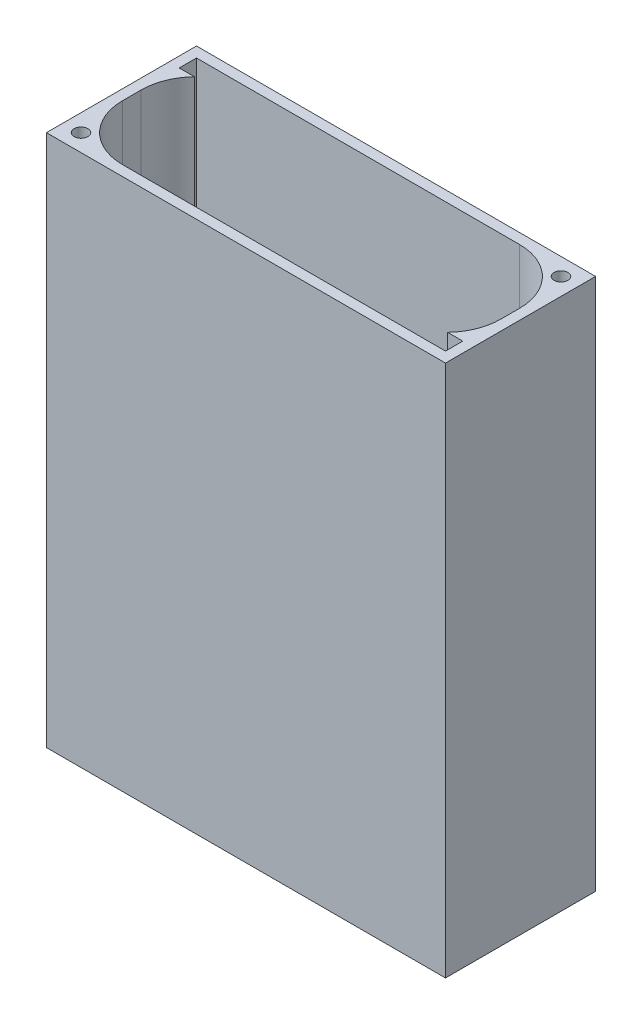
ISO-10303-21;
HEADER;
FILE_DESCRIPTION(('STEP AP214'),'2;1');
FILE_NAME('part.step','',(''),(''),'','','');
FILE_SCHEMA(('AUTOMOTIVE_DESIGN { 1 0 10303 214 1 1 1 1 }'));
ENDSEC;
DATA;
#1=APPLICATION_CONTEXT('core data for automotive mechanical design processes');
#2=APPLICATION_PROTOCOL_DEFINITION('international standard','automotive_design',2000,#1);
#3=PRODUCT_CONTEXT('',#1,'mechanical');
#4=PRODUCT('Part','Part','',(#3));
#5=PRODUCT_RELATED_PRODUCT_CATEGORY('part','',(#4));
#6=PRODUCT_DEFINITION_FORMATION('','',#4);
#7=PRODUCT_DEFINITION_CONTEXT('part definition',#1,'design');
#8=PRODUCT_DEFINITION('design','',#6,#7);
#9=PRODUCT_DEFINITION_SHAPE('','',#8);
#10=(LENGTH_UNIT() NAMED_UNIT(*) SI_UNIT(.MILLI.,.METRE.));
#11=(NAMED_UNIT(*) PLANE_ANGLE_UNIT() SI_UNIT($,.RADIAN.));
#12=(NAMED_UNIT(*) SI_UNIT($,.STERADIAN.) SOLID_ANGLE_UNIT());
#13=UNCERTAINTY_MEASURE_WITH_UNIT(LENGTH_MEASURE(1.E-05),#10,'distance_accuracy_value','');
#14=(GEOMETRIC_REPRESENTATION_CONTEXT(3) GLOBAL_UNCERTAINTY_ASSIGNED_CONTEXT((#13)) GLOBAL_UNIT_ASSIGNED_CONTEXT((#10,
#11,#12)) REPRESENTATION_CONTEXT('',''));
#15=CARTESIAN_POINT('',(0.,0.,0.));
#16=DIRECTION('',(0.,0.,1.));
#17=DIRECTION('',(1.,0.,0.));
#18=AXIS2_PLACEMENT_3D('',#15,#16,#17);
#19=CARTESIAN_POINT('',(0.,2.,0.));
#20=DIRECTION('',(1.,0.,0.));
#21=DIRECTION('',(0.,0.,-1.));
#22=AXIS2_PLACEMENT_3D('',#19,#20,#21);
#23=PLANE('',#22);
#24=DIRECTION('',(0.,0.,1.));
#25=VECTOR('',#24,1.);
#26=CARTESIAN_POINT('',(0.,0.,0.));
#27=LINE('',#26,#25);
#28=CARTESIAN_POINT('',(0.,0.,-21.7));
#29=VERTEX_POINT('',#28);
#30=CARTESIAN_POINT('',(0.,0.,0.));
#31=VERTEX_POINT('',#30);
#32=EDGE_CURVE('E221',#29,#31,#27,.T.);
#33=ORIENTED_EDGE('',*,*,#32,.T.);
#34=DIRECTION('',(0.,-1.,0.));
#35=VECTOR('',#34,1.);
#36=CARTESIAN_POINT('',(0.,2.,0.));
#37=LINE('',#36,#35);
#38=CARTESIAN_POINT('',(0.,77.,0.));
#39=VERTEX_POINT('',#38);
#40=EDGE_CURVE('E239',#39,#31,#37,.T.);
#41=ORIENTED_EDGE('',*,*,#40,.F.);
#42=DIRECTION('',(0.,0.,1.));
#43=VECTOR('',#42,1.);
#44=CARTESIAN_POINT('',(0.,77.,-21.7));
#45=LINE('',#44,#43);
#46=CARTESIAN_POINT('',(0.,77.,-21.7));
#47=VERTEX_POINT('',#46);
#48=EDGE_CURVE('E205',#47,#39,#45,.T.);
#49=ORIENTED_EDGE('',*,*,#48,.F.);
#50=DIRECTION('',(0.,-1.,0.));
#51=VECTOR('',#50,1.);
#52=CARTESIAN_POINT('',(0.,2.,-21.7));
#53=LINE('',#52,#51);
#54=EDGE_CURVE('E230',#47,#29,#53,.T.);
#55=ORIENTED_EDGE('',*,*,#54,.T.);
#56=EDGE_LOOP('',(#33,#41,#49,#55));
#57=FACE_BOUND('',#56,.T.);
#58=ADVANCED_FACE('F33',(#57),#23,.F.);
#59=CARTESIAN_POINT('',(0.,2.,0.));
#60=DIRECTION('',(0.,0.,-1.));
#61=DIRECTION('',(-1.,0.,0.));
#62=AXIS2_PLACEMENT_3D('',#59,#60,#61);
#63=PLANE('',#62);
#64=DIRECTION('',(1.,0.,0.));
#65=VECTOR('',#64,1.);
#66=CARTESIAN_POINT('',(0.,0.,0.));
#67=LINE('',#66,#65);
#68=CARTESIAN_POINT('',(57.7,0.,0.));
#69=VERTEX_POINT('',#68);
#70=EDGE_CURVE('E224',#31,#69,#67,.T.);
#71=ORIENTED_EDGE('',*,*,#70,.T.);
#72=DIRECTION('',(0.,-1.,0.));
#73=VECTOR('',#72,1.);
#74=CARTESIAN_POINT('',(57.7,2.,0.));
#75=LINE('',#74,#73);
#76=CARTESIAN_POINT('',(57.7,77.,0.));
#77=VERTEX_POINT('',#76);
#78=EDGE_CURVE('E236',#77,#69,#75,.T.);
#79=ORIENTED_EDGE('',*,*,#78,.F.);
#80=DIRECTION('',(1.,0.,0.));
#81=VECTOR('',#80,1.);
#82=CARTESIAN_POINT('',(0.,77.,0.));
#83=LINE('',#82,#81);
#84=EDGE_CURVE('E212',#39,#77,#83,.T.);
#85=ORIENTED_EDGE('',*,*,#84,.F.);
#86=ORIENTED_EDGE('',*,*,#40,.T.);
#87=EDGE_LOOP('',(#71,#79,#85,#86));
#88=FACE_BOUND('',#87,.T.);
#89=ADVANCED_FACE('F324',(#88),#63,.F.);
#90=CARTESIAN_POINT('',(57.7,2.,0.));
#91=DIRECTION('',(-1.,0.,0.));
#92=DIRECTION('',(0.,0.,1.));
#93=AXIS2_PLACEMENT_3D('',#90,#91,#92);
#94=PLANE('',#93);
#95=DIRECTION('',(0.,0.,-1.));
#96=VECTOR('',#95,1.);
#97=CARTESIAN_POINT('',(57.7,0.,0.));
#98=LINE('',#97,#96);
#99=CARTESIAN_POINT('',(57.7,0.,-21.7));
#100=VERTEX_POINT('',#99);
#101=EDGE_CURVE('E226',#69,#100,#98,.T.);
#102=ORIENTED_EDGE('',*,*,#101,.T.);
#103=DIRECTION('',(0.,-1.,0.));
#104=VECTOR('',#103,1.);
#105=CARTESIAN_POINT('',(57.7,2.,-21.7));
#106=LINE('',#105,#104);
#107=CARTESIAN_POINT('',(57.7,77.,-21.7));
#108=VERTEX_POINT('',#107);
#109=EDGE_CURVE('E233',#108,#100,#106,.T.);
#110=ORIENTED_EDGE('',*,*,#109,.F.);
#111=DIRECTION('',(0.,0.,-1.));
#112=VECTOR('',#111,1.);
#113=CARTESIAN_POINT('',(57.7,77.,-21.7));
#114=LINE('',#113,#112);
#115=EDGE_CURVE('E215',#77,#108,#114,.T.);
#116=ORIENTED_EDGE('',*,*,#115,.F.);
#117=ORIENTED_EDGE('',*,*,#78,.T.);
#118=EDGE_LOOP('',(#102,#110,#116,#117));
#119=FACE_BOUND('',#118,.T.);
#120=ADVANCED_FACE('F330',(#119),#94,.F.);
#121=CARTESIAN_POINT('',(0.,2.,-21.7));
#122=DIRECTION('',(0.,0.,1.));
#123=DIRECTION('',(1.,0.,0.));
#124=AXIS2_PLACEMENT_3D('',#121,#122,#123);
#125=PLANE('',#124);
#126=DIRECTION('',(-1.,0.,0.));
#127=VECTOR('',#126,1.);
#128=CARTESIAN_POINT('',(0.,0.,-21.7));
#129=LINE('',#128,#127);
#130=EDGE_CURVE('E228',#100,#29,#129,.T.);
#131=ORIENTED_EDGE('',*,*,#130,.T.);
#132=ORIENTED_EDGE('',*,*,#54,.F.);
#133=DIRECTION('',(-1.,0.,0.));
#134=VECTOR('',#133,1.);
#135=CARTESIAN_POINT('',(0.,77.,-21.7));
#136=LINE('',#135,#134);
#137=EDGE_CURVE('E218',#108,#47,#136,.T.);
#138=ORIENTED_EDGE('',*,*,#137,.F.);
#139=ORIENTED_EDGE('',*,*,#109,.T.);
#140=EDGE_LOOP('',(#131,#132,#138,#139));
#141=FACE_BOUND('',#140,.T.);
#142=ADVANCED_FACE('F461',(#141),#125,.F.);
#143=CARTESIAN_POINT('',(0.,0.,0.));
#144=DIRECTION('',(0.,-1.,0.));
#145=DIRECTION('',(0.,0.,-1.));
#146=AXIS2_PLACEMENT_3D('',#143,#144,#145);
#147=PLANE('',#146);
#148=CARTESIAN_POINT('',(46.85,0.,-10.85));
#149=DIRECTION('',(0.,-1.,0.));
#150=DIRECTION('',(0.,0.,-1.));
#151=AXIS2_PLACEMENT_3D('',#148,#149,#150);
#152=CIRCLE('',#151,1.5);
#153=CARTESIAN_POINT('',(46.85,0.,-12.35));
#154=VERTEX_POINT('',#153);
#155=EDGE_CURVE('E501',#154,#154,#152,.T.);
#156=ORIENTED_EDGE('',*,*,#155,.F.);
#157=EDGE_LOOP('',(#156));
#158=FACE_BOUND('',#157,.T.);
#159=CARTESIAN_POINT('',(10.85,0.,-10.85));
#160=DIRECTION('',(0.,-1.,0.));
#161=DIRECTION('',(0.,0.,-1.));
#162=AXIS2_PLACEMENT_3D('',#159,#160,#161);
#163=CIRCLE('',#162,1.5);
#164=CARTESIAN_POINT('',(10.85,0.,-12.35));
#165=VERTEX_POINT('',#164);
#166=EDGE_CURVE('E505',#165,#165,#163,.T.);
#167=ORIENTED_EDGE('',*,*,#166,.F.);
#168=EDGE_LOOP('',(#167));
#169=FACE_BOUND('',#168,.T.);
#170=CARTESIAN_POINT('',(28.85,0.,-10.85));
#171=DIRECTION('',(0.,-1.,0.));
#172=DIRECTION('',(0.,0.,-1.));
#173=AXIS2_PLACEMENT_3D('',#170,#171,#172);
#174=CIRCLE('',#173,1.5);
#175=CARTESIAN_POINT('',(28.85,0.,-12.35));
#176=VERTEX_POINT('',#175);
#177=EDGE_CURVE('E517',#176,#176,#174,.T.);
#178=ORIENTED_EDGE('',*,*,#177,.F.);
#179=EDGE_LOOP('',(#178));
#180=FACE_BOUND('',#179,.T.);
#181=ORIENTED_EDGE('',*,*,#32,.F.);
#182=ORIENTED_EDGE('',*,*,#130,.F.);
#183=ORIENTED_EDGE('',*,*,#101,.F.);
#184=ORIENTED_EDGE('',*,*,#70,.F.);
#185=EDGE_LOOP('',(#181,#182,#183,#184));
#186=FACE_BOUND('',#185,.T.);
#187=ADVANCED_FACE('F410',(#158,#169,#180,#186),#147,.T.);
#188=CARTESIAN_POINT('',(0.,77.,0.));
#189=DIRECTION('',(0.,1.,0.));
#190=DIRECTION('',(0.,0.,1.));
#191=AXIS2_PLACEMENT_3D('',#188,#189,#190);
#192=PLANE('',#191);
#193=CARTESIAN_POINT('',(2.5,77.,-2.5));
#194=DIRECTION('',(0.,1.,0.));
#195=DIRECTION('',(0.,0.,1.));
#196=AXIS2_PLACEMENT_3D('',#193,#194,#195);
#197=CIRCLE('',#196,1.);
#198=CARTESIAN_POINT('',(2.5,77.,-1.5));
#199=VERTEX_POINT('',#198);
#200=EDGE_CURVE('E520',#199,#199,#197,.T.);
#201=ORIENTED_EDGE('',*,*,#200,.F.);
#202=EDGE_LOOP('',(#201));
#203=FACE_BOUND('',#202,.T.);
#204=CARTESIAN_POINT('',(55.2,77.,-19.2));
#205=DIRECTION('',(0.,1.,0.));
#206=DIRECTION('',(0.,0.,1.));
#207=AXIS2_PLACEMENT_3D('',#204,#205,#206);
#208=CIRCLE('',#207,0.999999999999998);
#209=CARTESIAN_POINT('',(55.2,77.,-18.2));
#210=VERTEX_POINT('',#209);
#211=EDGE_CURVE('E174',#210,#210,#208,.T.);
#212=ORIENTED_EDGE('',*,*,#211,.F.);
#213=EDGE_LOOP('',(#212));
#214=FACE_BOUND('',#213,.T.);
#215=DIRECTION('',(-1.,0.,0.));
#216=VECTOR('',#215,1.);
#217=CARTESIAN_POINT('',(39.110599511968,77.,-4.));
#218=LINE('',#217,#216);
#219=CARTESIAN_POINT('',(56.2,77.,-4.));
#220=VERTEX_POINT('',#219);
#221=CARTESIAN_POINT('',(54.0094750193111,77.,-4.));
#222=VERTEX_POINT('',#221);
#223=EDGE_CURVE('E168',#220,#222,#218,.T.);
#224=ORIENTED_EDGE('',*,*,#223,.F.);
#225=DIRECTION('',(0.,0.,-1.));
#226=VECTOR('',#225,1.);
#227=CARTESIAN_POINT('',(56.2,77.,-1.5));
#228=LINE('',#227,#226);
#229=CARTESIAN_POINT('',(56.2,77.,-1.5));
#230=VERTEX_POINT('',#229);
#231=EDGE_CURVE('E171',#230,#220,#228,.T.);
#232=ORIENTED_EDGE('',*,*,#231,.F.);
#233=DIRECTION('',(1.,0.,0.));
#234=VECTOR('',#233,1.);
#235=CARTESIAN_POINT('',(1.5,77.,-1.5));
#236=LINE('',#235,#234);
#237=CARTESIAN_POINT('',(9.5,77.,-1.5));
#238=VERTEX_POINT('',#237);
#239=EDGE_CURVE('E161',#238,#230,#236,.T.);
#240=ORIENTED_EDGE('',*,*,#239,.F.);
#241=CARTESIAN_POINT('',(9.5,77.,-9.5));
#242=DIRECTION('',(0.,1.,0.));
#243=DIRECTION('',(0.,0.,1.));
#244=AXIS2_PLACEMENT_3D('',#241,#242,#243);
#245=CIRCLE('',#244,8.);
#246=CARTESIAN_POINT('',(1.5,77.,-9.5));
#247=VERTEX_POINT('',#246);
#248=EDGE_CURVE('E268',#238,#247,#245,.F.);
#249=ORIENTED_EDGE('',*,*,#248,.T.);
#250=DIRECTION('',(0.,0.,1.));
#251=VECTOR('',#250,1.);
#252=CARTESIAN_POINT('',(1.5,77.,-20.2));
#253=LINE('',#252,#251);
#254=CARTESIAN_POINT('',(1.5,77.,-12.2));
#255=VERTEX_POINT('',#254);
#256=EDGE_CURVE('E198',#255,#247,#253,.T.);
#257=ORIENTED_EDGE('',*,*,#256,.F.);
#258=CARTESIAN_POINT('',(9.5,77.,-12.2));
#259=DIRECTION('',(0.,1.,0.));
#260=DIRECTION('',(0.,0.,1.));
#261=AXIS2_PLACEMENT_3D('',#258,#259,#260);
#262=CIRCLE('',#261,8.);
#263=CARTESIAN_POINT('',(3.69052498068887,77.,-17.7));
#264=VERTEX_POINT('',#263);
#265=EDGE_CURVE('E270',#255,#264,#262,.F.);
#266=ORIENTED_EDGE('',*,*,#265,.T.);
#267=DIRECTION('',(1.,0.,0.));
#268=VECTOR('',#267,1.);
#269=CARTESIAN_POINT('',(40.0835873967236,77.,-17.7));
#270=LINE('',#269,#268);
#271=CARTESIAN_POINT('',(1.5,77.,-17.7));
#272=VERTEX_POINT('',#271);
#273=EDGE_CURVE('E56',#272,#264,#270,.T.);
#274=ORIENTED_EDGE('',*,*,#273,.F.);
#275=DIRECTION('',(0.,0.,1.));
#276=VECTOR('',#275,1.);
#277=CARTESIAN_POINT('',(1.5,77.,-20.2));
#278=LINE('',#277,#276);
#279=CARTESIAN_POINT('',(1.5,77.,-20.2));
#280=VERTEX_POINT('',#279);
#281=EDGE_CURVE('E179',#280,#272,#278,.T.);
#282=ORIENTED_EDGE('',*,*,#281,.F.);
#283=DIRECTION('',(-1.,0.,0.));
#284=VECTOR('',#283,1.);
#285=CARTESIAN_POINT('',(1.5,77.,-20.2));
#286=LINE('',#285,#284);
#287=CARTESIAN_POINT('',(48.2,77.,-20.2));
#288=VERTEX_POINT('',#287);
#289=EDGE_CURVE('E196',#288,#280,#286,.T.);
#290=ORIENTED_EDGE('',*,*,#289,.F.);
#291=CARTESIAN_POINT('',(48.2,77.,-12.2));
#292=DIRECTION('',(0.,1.,0.));
#293=DIRECTION('',(0.,0.,1.));
#294=AXIS2_PLACEMENT_3D('',#291,#292,#293);
#295=CIRCLE('',#294,8.);
#296=CARTESIAN_POINT('',(56.2,77.,-12.2));
#297=VERTEX_POINT('',#296);
#298=EDGE_CURVE('E266',#288,#297,#295,.F.);
#299=ORIENTED_EDGE('',*,*,#298,.T.);
#300=DIRECTION('',(0.,0.,-1.));
#301=VECTOR('',#300,1.);
#302=CARTESIAN_POINT('',(56.2,77.,-20.2));
#303=LINE('',#302,#301);
#304=CARTESIAN_POINT('',(56.2,77.,-9.5));
#305=VERTEX_POINT('',#304);
#306=EDGE_CURVE('E202',#305,#297,#303,.T.);
#307=ORIENTED_EDGE('',*,*,#306,.F.);
#308=CARTESIAN_POINT('',(48.2,77.,-9.5));
#309=DIRECTION('',(0.,1.,0.));
#310=DIRECTION('',(0.,0.,1.));
#311=AXIS2_PLACEMENT_3D('',#308,#309,#310);
#312=CIRCLE('',#311,8.);
#313=EDGE_CURVE('E263',#305,#222,#312,.F.);
#314=ORIENTED_EDGE('',*,*,#313,.T.);
#315=EDGE_LOOP('',(#224,#232,#240,#249,#257,#266,#274,#282,#290,#299,#307,#314));
#316=FACE_BOUND('',#315,.T.);
#317=ORIENTED_EDGE('',*,*,#48,.T.);
#318=ORIENTED_EDGE('',*,*,#84,.T.);
#319=ORIENTED_EDGE('',*,*,#115,.T.);
#320=ORIENTED_EDGE('',*,*,#137,.T.);
#321=EDGE_LOOP('',(#317,#318,#319,#320));
#322=FACE_BOUND('',#321,.T.);
#323=ADVANCED_FACE('F279',(#203,#214,#316,#322),#192,.T.);
#324=CARTESIAN_POINT('',(1.5,77.,-20.2));
#325=DIRECTION('',(0.,0.,1.));
#326=DIRECTION('',(1.,0.,0.));
#327=AXIS2_PLACEMENT_3D('',#324,#325,#326);
#328=PLANE('',#327);
#329=ORIENTED_EDGE('',*,*,#289,.T.);
#330=DIRECTION('',(0.,1.,0.));
#331=VECTOR('',#330,1.);
#332=CARTESIAN_POINT('',(1.5,-36.6644955534222,-20.2));
#333=LINE('',#332,#331);
#334=CARTESIAN_POINT('',(1.5,2.,-20.2));
#335=VERTEX_POINT('',#334);
#336=EDGE_CURVE('E182',#335,#280,#333,.T.);
#337=ORIENTED_EDGE('',*,*,#336,.F.);
#338=DIRECTION('',(-1.,0.,0.));
#339=VECTOR('',#338,1.);
#340=CARTESIAN_POINT('',(1.5,2.,-20.2));
#341=LINE('',#340,#339);
#342=CARTESIAN_POINT('',(48.2,2.,-20.2));
#343=VERTEX_POINT('',#342);
#344=EDGE_CURVE('E188',#343,#335,#341,.T.);
#345=ORIENTED_EDGE('',*,*,#344,.F.);
#346=DIRECTION('',(0.,-1.,0.));
#347=VECTOR('',#346,1.);
#348=CARTESIAN_POINT('',(48.2,77.,-20.2));
#349=LINE('',#348,#347);
#350=EDGE_CURVE('E256',#343,#288,#349,.F.);
#351=ORIENTED_EDGE('',*,*,#350,.T.);
#352=EDGE_LOOP('',(#329,#337,#345,#351));
#353=FACE_BOUND('',#352,.T.);
#354=ADVANCED_FACE('F309',(#353),#328,.T.);
#355=CARTESIAN_POINT('',(1.5,77.,-20.2));
#356=DIRECTION('',(1.,0.,0.));
#357=DIRECTION('',(0.,0.,-1.));
#358=AXIS2_PLACEMENT_3D('',#355,#356,#357);
#359=PLANE('',#358);
#360=ORIENTED_EDGE('',*,*,#256,.T.);
#361=DIRECTION('',(0.,-1.,0.));
#362=VECTOR('',#361,1.);
#363=CARTESIAN_POINT('',(1.5,2.,-9.5));
#364=LINE('',#363,#362);
#365=CARTESIAN_POINT('',(1.5,2.,-9.5));
#366=VERTEX_POINT('',#365);
#367=EDGE_CURVE('E260',#247,#366,#364,.T.);
#368=ORIENTED_EDGE('',*,*,#367,.T.);
#369=DIRECTION('',(0.,0.,1.));
#370=VECTOR('',#369,1.);
#371=CARTESIAN_POINT('',(1.5,2.,-20.2));
#372=LINE('',#371,#370);
#373=CARTESIAN_POINT('',(1.5,2.,-12.2));
#374=VERTEX_POINT('',#373);
#375=EDGE_CURVE('E155',#374,#366,#372,.T.);
#376=ORIENTED_EDGE('',*,*,#375,.F.);
#377=DIRECTION('',(0.,-1.,0.));
#378=VECTOR('',#377,1.);
#379=CARTESIAN_POINT('',(1.5,77.,-12.2));
#380=LINE('',#379,#378);
#381=EDGE_CURVE('E258',#374,#255,#380,.F.);
#382=ORIENTED_EDGE('',*,*,#381,.T.);
#383=EDGE_LOOP('',(#360,#368,#376,#382));
#384=FACE_BOUND('',#383,.T.);
#385=ADVANCED_FACE('F285',(#384),#359,.T.);
#386=CARTESIAN_POINT('',(1.5,77.,-1.5));
#387=DIRECTION('',(0.,0.,-1.));
#388=DIRECTION('',(-1.,0.,0.));
#389=AXIS2_PLACEMENT_3D('',#386,#387,#388);
#390=PLANE('',#389);
#391=ORIENTED_EDGE('',*,*,#239,.T.);
#392=DIRECTION('',(0.,1.,0.));
#393=VECTOR('',#392,1.);
#394=CARTESIAN_POINT('',(56.2,2.,-1.5));
#395=LINE('',#394,#393);
#396=CARTESIAN_POINT('',(56.2,2.,-1.5));
#397=VERTEX_POINT('',#396);
#398=EDGE_CURVE('E158',#397,#230,#395,.T.);
#399=ORIENTED_EDGE('',*,*,#398,.F.);
#400=DIRECTION('',(1.,0.,0.));
#401=VECTOR('',#400,1.);
#402=CARTESIAN_POINT('',(1.5,2.,-1.5));
#403=LINE('',#402,#401);
#404=CARTESIAN_POINT('',(9.5,2.,-1.5));
#405=VERTEX_POINT('',#404);
#406=EDGE_CURVE('E145',#405,#397,#403,.T.);
#407=ORIENTED_EDGE('',*,*,#406,.F.);
#408=DIRECTION('',(0.,-1.,0.));
#409=VECTOR('',#408,1.);
#410=CARTESIAN_POINT('',(9.5,77.,-1.5));
#411=LINE('',#410,#409);
#412=EDGE_CURVE('E242',#405,#238,#411,.F.);
#413=ORIENTED_EDGE('',*,*,#412,.T.);
#414=EDGE_LOOP('',(#391,#399,#407,#413));
#415=FACE_BOUND('',#414,.T.);
#416=ADVANCED_FACE('F159',(#415),#390,.T.);
#417=CARTESIAN_POINT('',(56.2,77.,-20.2));
#418=DIRECTION('',(-1.,0.,0.));
#419=DIRECTION('',(0.,0.,1.));
#420=AXIS2_PLACEMENT_3D('',#417,#418,#419);
#421=PLANE('',#420);
#422=DIRECTION('',(0.,0.,-1.));
#423=VECTOR('',#422,1.);
#424=CARTESIAN_POINT('',(56.2,2.,-20.2));
#425=LINE('',#424,#423);
#426=CARTESIAN_POINT('',(56.2,2.,-9.5));
#427=VERTEX_POINT('',#426);
#428=CARTESIAN_POINT('',(56.2,2.,-12.2));
#429=VERTEX_POINT('',#428);
#430=EDGE_CURVE('E154',#427,#429,#425,.T.);
#431=ORIENTED_EDGE('',*,*,#430,.F.);
#432=DIRECTION('',(0.,-1.,0.));
#433=VECTOR('',#432,1.);
#434=CARTESIAN_POINT('',(56.2,77.,-9.5));
#435=LINE('',#434,#433);
#436=EDGE_CURVE('E254',#427,#305,#435,.F.);
#437=ORIENTED_EDGE('',*,*,#436,.T.);
#438=ORIENTED_EDGE('',*,*,#306,.T.);
#439=DIRECTION('',(0.,-1.,0.));
#440=VECTOR('',#439,1.);
#441=CARTESIAN_POINT('',(56.2,2.,-12.2));
#442=LINE('',#441,#440);
#443=EDGE_CURVE('E251',#297,#429,#442,.T.);
#444=ORIENTED_EDGE('',*,*,#443,.T.);
#445=EDGE_LOOP('',(#431,#437,#438,#444));
#446=FACE_BOUND('',#445,.T.);
#447=ADVANCED_FACE('F299',(#446),#421,.T.);
#448=CARTESIAN_POINT('',(0.,2.,0.));
#449=DIRECTION('',(0.,-1.,0.));
#450=DIRECTION('',(0.,0.,-1.));
#451=AXIS2_PLACEMENT_3D('',#448,#449,#450);
#452=PLANE('',#451);
#453=CARTESIAN_POINT('',(46.85,2.,-10.85));
#454=DIRECTION('',(0.,1.,0.));
#455=DIRECTION('',(0.,0.,1.));
#456=AXIS2_PLACEMENT_3D('',#453,#454,#455);
#457=CIRCLE('',#456,1.5);
#458=CARTESIAN_POINT('',(46.85,2.,-9.35));
#459=VERTEX_POINT('',#458);
#460=EDGE_CURVE('E504',#459,#459,#457,.T.);
#461=ORIENTED_EDGE('',*,*,#460,.F.);
#462=EDGE_LOOP('',(#461));
#463=FACE_BOUND('',#462,.T.);
#464=CARTESIAN_POINT('',(10.85,2.,-10.85));
#465=DIRECTION('',(0.,1.,0.));
#466=DIRECTION('',(0.,0.,1.));
#467=AXIS2_PLACEMENT_3D('',#464,#465,#466);
#468=CIRCLE('',#467,1.5);
#469=CARTESIAN_POINT('',(10.85,2.,-9.35));
#470=VERTEX_POINT('',#469);
#471=EDGE_CURVE('E506',#470,#470,#468,.T.);
#472=ORIENTED_EDGE('',*,*,#471,.F.);
#473=EDGE_LOOP('',(#472));
#474=FACE_BOUND('',#473,.T.);
#475=CARTESIAN_POINT('',(28.85,2.,-10.85));
#476=DIRECTION('',(0.,1.,0.));
#477=DIRECTION('',(0.,0.,1.));
#478=AXIS2_PLACEMENT_3D('',#475,#476,#477);
#479=CIRCLE('',#478,1.5);
#480=CARTESIAN_POINT('',(28.85,2.,-9.35));
#481=VERTEX_POINT('',#480);
#482=EDGE_CURVE('E514',#481,#481,#479,.T.);
#483=ORIENTED_EDGE('',*,*,#482,.F.);
#484=EDGE_LOOP('',(#483));
#485=FACE_BOUND('',#484,.T.);
#486=ORIENTED_EDGE('',*,*,#406,.T.);
#487=DIRECTION('',(0.,0.,-1.));
#488=VECTOR('',#487,1.);
#489=CARTESIAN_POINT('',(56.2,2.,-1.5));
#490=LINE('',#489,#488);
#491=CARTESIAN_POINT('',(56.2,2.,-4.));
#492=VERTEX_POINT('',#491);
#493=EDGE_CURVE('E149',#397,#492,#490,.T.);
#494=ORIENTED_EDGE('',*,*,#493,.T.);
#495=DIRECTION('',(-1.,0.,0.));
#496=VECTOR('',#495,1.);
#497=CARTESIAN_POINT('',(39.110599511968,2.,-4.));
#498=LINE('',#497,#496);
#499=CARTESIAN_POINT('',(54.0094750193111,2.,-4.));
#500=VERTEX_POINT('',#499);
#501=EDGE_CURVE('E48',#492,#500,#498,.T.);
#502=ORIENTED_EDGE('',*,*,#501,.T.);
#503=CARTESIAN_POINT('',(48.2,2.,-9.5));
#504=DIRECTION('',(0.,-1.,0.));
#505=DIRECTION('',(0.,0.,-1.));
#506=AXIS2_PLACEMENT_3D('',#503,#504,#505);
#507=CIRCLE('',#506,8.);
#508=EDGE_CURVE('E249',#500,#427,#507,.F.);
#509=ORIENTED_EDGE('',*,*,#508,.T.);
#510=ORIENTED_EDGE('',*,*,#430,.T.);
#511=CARTESIAN_POINT('',(48.2,2.,-12.2));
#512=DIRECTION('',(0.,-1.,0.));
#513=DIRECTION('',(0.,0.,-1.));
#514=AXIS2_PLACEMENT_3D('',#511,#512,#513);
#515=CIRCLE('',#514,8.);
#516=EDGE_CURVE('E247',#429,#343,#515,.F.);
#517=ORIENTED_EDGE('',*,*,#516,.T.);
#518=ORIENTED_EDGE('',*,*,#344,.T.);
#519=DIRECTION('',(0.,0.,1.));
#520=VECTOR('',#519,1.);
#521=CARTESIAN_POINT('',(1.5,2.,-20.2));
#522=LINE('',#521,#520);
#523=CARTESIAN_POINT('',(1.5,2.,-17.7));
#524=VERTEX_POINT('',#523);
#525=EDGE_CURVE('E190',#335,#524,#522,.T.);
#526=ORIENTED_EDGE('',*,*,#525,.T.);
#527=DIRECTION('',(1.,0.,0.));
#528=VECTOR('',#527,1.);
#529=CARTESIAN_POINT('',(40.0835873967236,2.,-17.7));
#530=LINE('',#529,#528);
#531=CARTESIAN_POINT('',(3.69052498068886,2.,-17.7));
#532=VERTEX_POINT('',#531);
#533=EDGE_CURVE('E185',#524,#532,#530,.T.);
#534=ORIENTED_EDGE('',*,*,#533,.T.);
#535=CARTESIAN_POINT('',(9.5,2.,-12.2));
#536=DIRECTION('',(0.,-1.,0.));
#537=DIRECTION('',(0.,0.,-1.));
#538=AXIS2_PLACEMENT_3D('',#535,#536,#537);
#539=CIRCLE('',#538,8.);
#540=EDGE_CURVE('E244',#532,#374,#539,.F.);
#541=ORIENTED_EDGE('',*,*,#540,.T.);
#542=ORIENTED_EDGE('',*,*,#375,.T.);
#543=CARTESIAN_POINT('',(9.5,2.,-9.5));
#544=DIRECTION('',(0.,-1.,0.));
#545=DIRECTION('',(0.,0.,-1.));
#546=AXIS2_PLACEMENT_3D('',#543,#544,#545);
#547=CIRCLE('',#546,8.);
#548=EDGE_CURVE('E151',#366,#405,#547,.F.);
#549=ORIENTED_EDGE('',*,*,#548,.T.);
#550=EDGE_LOOP('',(#486,#494,#502,#509,#510,#517,#518,#526,#534,#541,#542,#549));
#551=FACE_BOUND('',#550,.T.);
#552=ADVANCED_FACE('F147',(#463,#474,#485,#551),#452,.F.);
#553=CARTESIAN_POINT('',(48.2,77.,-9.5));
#554=DIRECTION('',(0.,1.,0.));
#555=DIRECTION('',(0.,0.,1.));
#556=AXIS2_PLACEMENT_3D('',#553,#554,#555);
#557=CYLINDRICAL_SURFACE('',#556,8.);
#558=ORIENTED_EDGE('',*,*,#508,.F.);
#559=DIRECTION('',(0.,1.,0.));
#560=VECTOR('',#559,1.);
#561=CARTESIAN_POINT('',(54.0094750193111,77.,-4.));
#562=LINE('',#561,#560);
#563=EDGE_CURVE('E11',#500,#222,#562,.T.);
#564=ORIENTED_EDGE('',*,*,#563,.T.);
#565=ORIENTED_EDGE('',*,*,#313,.F.);
#566=ORIENTED_EDGE('',*,*,#436,.F.);
#567=EDGE_LOOP('',(#558,#564,#565,#566));
#568=FACE_BOUND('',#567,.T.);
#569=ADVANCED_FACE('F295',(#568),#557,.F.);
#570=CARTESIAN_POINT('',(48.2,77.,-12.2));
#571=DIRECTION('',(0.,1.,0.));
#572=DIRECTION('',(0.,0.,1.));
#573=AXIS2_PLACEMENT_3D('',#570,#571,#572);
#574=CYLINDRICAL_SURFACE('',#573,8.);
#575=ORIENTED_EDGE('',*,*,#298,.F.);
#576=ORIENTED_EDGE('',*,*,#350,.F.);
#577=ORIENTED_EDGE('',*,*,#516,.F.);
#578=ORIENTED_EDGE('',*,*,#443,.F.);
#579=EDGE_LOOP('',(#575,#576,#577,#578));
#580=FACE_BOUND('',#579,.T.);
#581=ADVANCED_FACE('F303',(#580),#574,.F.);
#582=CARTESIAN_POINT('',(9.5,77.,-9.5));
#583=DIRECTION('',(0.,1.,0.));
#584=DIRECTION('',(0.,0.,1.));
#585=AXIS2_PLACEMENT_3D('',#582,#583,#584);
#586=CYLINDRICAL_SURFACE('',#585,8.);
#587=ORIENTED_EDGE('',*,*,#248,.F.);
#588=ORIENTED_EDGE('',*,*,#412,.F.);
#589=ORIENTED_EDGE('',*,*,#548,.F.);
#590=ORIENTED_EDGE('',*,*,#367,.F.);
#591=EDGE_LOOP('',(#587,#588,#589,#590));
#592=FACE_BOUND('',#591,.T.);
#593=ADVANCED_FACE('F288',(#592),#586,.F.);
#594=CARTESIAN_POINT('',(9.5,77.,-12.2));
#595=DIRECTION('',(0.,1.,0.));
#596=DIRECTION('',(0.,0.,1.));
#597=AXIS2_PLACEMENT_3D('',#594,#595,#596);
#598=CYLINDRICAL_SURFACE('',#597,8.);
#599=ORIENTED_EDGE('',*,*,#540,.F.);
#600=DIRECTION('',(0.,1.,0.));
#601=VECTOR('',#600,1.);
#602=CARTESIAN_POINT('',(3.69052498068887,77.,-17.7));
#603=LINE('',#602,#601);
#604=EDGE_CURVE('E41',#532,#264,#603,.T.);
#605=ORIENTED_EDGE('',*,*,#604,.T.);
#606=ORIENTED_EDGE('',*,*,#265,.F.);
#607=ORIENTED_EDGE('',*,*,#381,.F.);
#608=EDGE_LOOP('',(#599,#605,#606,#607));
#609=FACE_BOUND('',#608,.T.);
#610=ADVANCED_FACE('F35',(#609),#598,.F.);
#611=CARTESIAN_POINT('',(40.0835873967236,-36.6644955534222,-17.7));
#612=DIRECTION('',(0.,0.,1.));
#613=DIRECTION('',(1.,0.,0.));
#614=AXIS2_PLACEMENT_3D('',#611,#612,#613);
#615=PLANE('',#614);
#616=ORIENTED_EDGE('',*,*,#533,.F.);
#617=DIRECTION('',(0.,1.,0.));
#618=VECTOR('',#617,1.);
#619=CARTESIAN_POINT('',(1.5,-36.6644955534222,-17.7));
#620=LINE('',#619,#618);
#621=EDGE_CURVE('E189',#524,#272,#620,.T.);
#622=ORIENTED_EDGE('',*,*,#621,.T.);
#623=ORIENTED_EDGE('',*,*,#273,.T.);
#624=ORIENTED_EDGE('',*,*,#604,.F.);
#625=EDGE_LOOP('',(#616,#622,#623,#624));
#626=FACE_BOUND('',#625,.T.);
#627=ADVANCED_FACE('F314',(#626),#615,.F.);
#628=CARTESIAN_POINT('',(1.5,-36.6644955534222,-20.2));
#629=DIRECTION('',(-1.,0.,0.));
#630=DIRECTION('',(0.,0.,1.));
#631=AXIS2_PLACEMENT_3D('',#628,#629,#630);
#632=PLANE('',#631);
#633=ORIENTED_EDGE('',*,*,#336,.T.);
#634=ORIENTED_EDGE('',*,*,#281,.T.);
#635=ORIENTED_EDGE('',*,*,#621,.F.);
#636=ORIENTED_EDGE('',*,*,#525,.F.);
#637=EDGE_LOOP('',(#633,#634,#635,#636));
#638=FACE_BOUND('',#637,.T.);
#639=ADVANCED_FACE('F312',(#638),#632,.F.);
#640=CARTESIAN_POINT('',(39.110599511968,2.,-4.));
#641=DIRECTION('',(0.,0.,-1.));
#642=DIRECTION('',(-1.,0.,0.));
#643=AXIS2_PLACEMENT_3D('',#640,#641,#642);
#644=PLANE('',#643);
#645=ORIENTED_EDGE('',*,*,#501,.F.);
#646=DIRECTION('',(0.,1.,0.));
#647=VECTOR('',#646,1.);
#648=CARTESIAN_POINT('',(56.2,2.,-4.));
#649=LINE('',#648,#647);
#650=EDGE_CURVE('E165',#492,#220,#649,.T.);
#651=ORIENTED_EDGE('',*,*,#650,.T.);
#652=ORIENTED_EDGE('',*,*,#223,.T.);
#653=ORIENTED_EDGE('',*,*,#563,.F.);
#654=EDGE_LOOP('',(#645,#651,#652,#653));
#655=FACE_BOUND('',#654,.T.);
#656=ADVANCED_FACE('F292',(#655),#644,.F.);
#657=CARTESIAN_POINT('',(56.2,2.,-1.5));
#658=DIRECTION('',(1.,0.,0.));
#659=DIRECTION('',(0.,0.,-1.));
#660=AXIS2_PLACEMENT_3D('',#657,#658,#659);
#661=PLANE('',#660);
#662=ORIENTED_EDGE('',*,*,#231,.T.);
#663=ORIENTED_EDGE('',*,*,#650,.F.);
#664=ORIENTED_EDGE('',*,*,#493,.F.);
#665=ORIENTED_EDGE('',*,*,#398,.T.);
#666=EDGE_LOOP('',(#662,#663,#664,#665));
#667=FACE_BOUND('',#666,.T.);
#668=ADVANCED_FACE('F167',(#667),#661,.F.);
#669=CARTESIAN_POINT('',(55.2,69.,-19.2));
#670=DIRECTION('',(0.,1.,0.));
#671=DIRECTION('',(0.,0.,1.));
#672=AXIS2_PLACEMENT_3D('',#669,#670,#671);
#673=CYLINDRICAL_SURFACE('',#672,0.999999999999998);
#674=CARTESIAN_POINT('',(55.2,69.,-19.2));
#675=DIRECTION('',(0.,1.,0.));
#676=DIRECTION('',(0.,0.,1.));
#677=AXIS2_PLACEMENT_3D('',#674,#675,#676);
#678=CIRCLE('',#677,0.999999999999998);
#679=CARTESIAN_POINT('',(55.2,69.,-18.2));
#680=VERTEX_POINT('',#679);
#681=EDGE_CURVE('E177',#680,#680,#678,.T.);
#682=ORIENTED_EDGE('',*,*,#681,.F.);
#683=EDGE_LOOP('',(#682));
#684=FACE_BOUND('',#683,.T.);
#685=ORIENTED_EDGE('',*,*,#211,.T.);
#686=EDGE_LOOP('',(#685));
#687=FACE_BOUND('',#686,.T.);
#688=ADVANCED_FACE('F400',(#684,#687),#673,.F.);
#689=CARTESIAN_POINT('',(55.2,69.,-19.2));
#690=DIRECTION('',(0.,1.,0.));
#691=DIRECTION('',(0.,0.,1.));
#692=AXIS2_PLACEMENT_3D('',#689,#690,#691);
#693=PLANE('',#692);
#694=ORIENTED_EDGE('',*,*,#681,.T.);
#695=EDGE_LOOP('',(#694));
#696=FACE_BOUND('',#695,.T.);
#697=ADVANCED_FACE('F421',(#696),#693,.T.);
#698=CARTESIAN_POINT('',(2.5,69.,-2.5));
#699=DIRECTION('',(0.,1.,0.));
#700=DIRECTION('',(0.,0.,1.));
#701=AXIS2_PLACEMENT_3D('',#698,#699,#700);
#702=CYLINDRICAL_SURFACE('',#701,1.);
#703=CARTESIAN_POINT('',(2.5,69.,-2.5));
#704=DIRECTION('',(0.,1.,0.));
#705=DIRECTION('',(0.,0.,1.));
#706=AXIS2_PLACEMENT_3D('',#703,#704,#705);
#707=CIRCLE('',#706,1.);
#708=CARTESIAN_POINT('',(2.5,69.,-1.5));
#709=VERTEX_POINT('',#708);
#710=EDGE_CURVE('E521',#709,#709,#707,.T.);
#711=ORIENTED_EDGE('',*,*,#710,.F.);
#712=EDGE_LOOP('',(#711));
#713=FACE_BOUND('',#712,.T.);
#714=ORIENTED_EDGE('',*,*,#200,.T.);
#715=EDGE_LOOP('',(#714));
#716=FACE_BOUND('',#715,.T.);
#717=ADVANCED_FACE('F431',(#713,#716),#702,.F.);
#718=CARTESIAN_POINT('',(2.5,69.,-2.5));
#719=DIRECTION('',(0.,1.,0.));
#720=DIRECTION('',(0.,0.,1.));
#721=AXIS2_PLACEMENT_3D('',#718,#719,#720);
#722=PLANE('',#721);
#723=ORIENTED_EDGE('',*,*,#710,.T.);
#724=EDGE_LOOP('',(#723));
#725=FACE_BOUND('',#724,.T.);
#726=ADVANCED_FACE('F441',(#725),#722,.T.);
#727=CARTESIAN_POINT('',(28.85,-8.,-10.85));
#728=DIRECTION('',(0.,1.,0.));
#729=DIRECTION('',(0.,0.,1.));
#730=AXIS2_PLACEMENT_3D('',#727,#728,#729);
#731=CYLINDRICAL_SURFACE('',#730,1.5);
#732=ORIENTED_EDGE('',*,*,#177,.T.);
#733=EDGE_LOOP('',(#732));
#734=FACE_BOUND('',#733,.T.);
#735=ORIENTED_EDGE('',*,*,#482,.T.);
#736=EDGE_LOOP('',(#735));
#737=FACE_BOUND('',#736,.T.);
#738=ADVANCED_FACE('F451',(#734,#737),#731,.F.);
#739=CARTESIAN_POINT('',(10.85,-8.,-10.85));
#740=DIRECTION('',(0.,1.,0.));
#741=DIRECTION('',(0.,0.,1.));
#742=AXIS2_PLACEMENT_3D('',#739,#740,#741);
#743=CYLINDRICAL_SURFACE('',#742,1.5);
#744=ORIENTED_EDGE('',*,*,#166,.T.);
#745=EDGE_LOOP('',(#744));
#746=FACE_BOUND('',#745,.T.);
#747=ORIENTED_EDGE('',*,*,#471,.T.);
#748=EDGE_LOOP('',(#747));
#749=FACE_BOUND('',#748,.T.);
#750=ADVANCED_FACE('F474',(#746,#749),#743,.F.);
#751=CARTESIAN_POINT('',(46.85,-8.,-10.85));
#752=DIRECTION('',(0.,1.,0.));
#753=DIRECTION('',(0.,0.,1.));
#754=AXIS2_PLACEMENT_3D('',#751,#752,#753);
#755=CYLINDRICAL_SURFACE('',#754,1.5);
#756=ORIENTED_EDGE('',*,*,#155,.T.);
#757=EDGE_LOOP('',(#756));
#758=FACE_BOUND('',#757,.T.);
#759=ORIENTED_EDGE('',*,*,#460,.T.);
#760=EDGE_LOOP('',(#759));
#761=FACE_BOUND('',#760,.T.);
#762=ADVANCED_FACE('F484',(#758,#761),#755,.F.);
#763=CLOSED_SHELL('',(#58,#89,#120,#142,#187,#323,#354,#385,#416,#447,#552,#569,#581,#593,#610,
#627,#639,#656,#668,#688,#697,#717,#726,#738,#750,#762));
#764=MANIFOLD_SOLID_BREP('B2',#763);
#765=ADVANCED_BREP_SHAPE_REPRESENTATION('',(#18,#764),#14);
#766=SHAPE_DEFINITION_REPRESENTATION(#9,#765);
ENDSEC;
END-ISO-10303-21;
